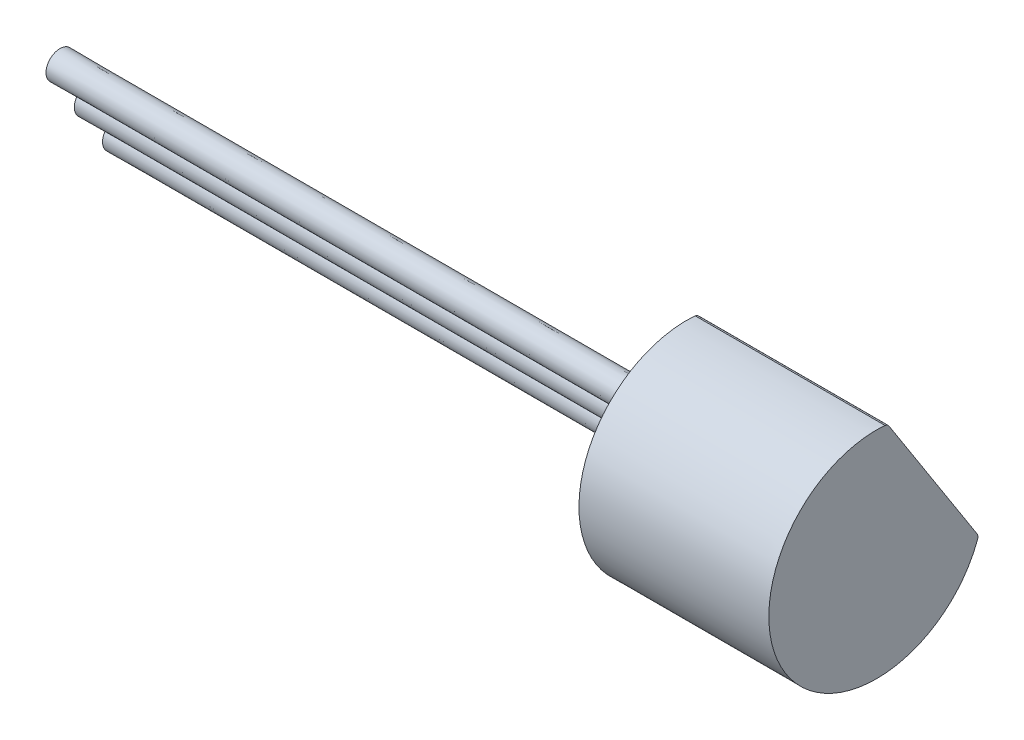
ISO-10303-21;
HEADER;
FILE_DESCRIPTION(('STEP AP214'),'2;1');
FILE_NAME('part.step','',(''),(''),'','','');
FILE_SCHEMA(('AUTOMOTIVE_DESIGN { 1 0 10303 214 1 1 1 1 }'));
ENDSEC;
DATA;
#1=APPLICATION_CONTEXT('core data for automotive mechanical design processes');
#2=APPLICATION_PROTOCOL_DEFINITION('international standard','automotive_design',2000,#1);
#3=PRODUCT_CONTEXT('',#1,'mechanical');
#4=PRODUCT('Part','Part','',(#3));
#5=PRODUCT_RELATED_PRODUCT_CATEGORY('part','',(#4));
#6=PRODUCT_DEFINITION_FORMATION('','',#4);
#7=PRODUCT_DEFINITION_CONTEXT('part definition',#1,'design');
#8=PRODUCT_DEFINITION('design','',#6,#7);
#9=PRODUCT_DEFINITION_SHAPE('','',#8);
#10=(LENGTH_UNIT() NAMED_UNIT(*) SI_UNIT(.MILLI.,.METRE.));
#11=(NAMED_UNIT(*) PLANE_ANGLE_UNIT() SI_UNIT($,.RADIAN.));
#12=(NAMED_UNIT(*) SI_UNIT($,.STERADIAN.) SOLID_ANGLE_UNIT());
#13=UNCERTAINTY_MEASURE_WITH_UNIT(LENGTH_MEASURE(1.E-05),#10,'distance_accuracy_value','');
#14=(GEOMETRIC_REPRESENTATION_CONTEXT(3) GLOBAL_UNCERTAINTY_ASSIGNED_CONTEXT((#13)) GLOBAL_UNIT_ASSIGNED_CONTEXT((#10,
#11,#12)) REPRESENTATION_CONTEXT('',''));
#15=CARTESIAN_POINT('',(0.,0.,0.));
#16=DIRECTION('',(0.,0.,1.));
#17=DIRECTION('',(1.,0.,0.));
#18=AXIS2_PLACEMENT_3D('',#15,#16,#17);
#19=CARTESIAN_POINT('',(0.,225.712503506665,-148.652495898599));
#20=DIRECTION('',(1.,0.,0.));
#21=DIRECTION('',(0.,0.,-1.));
#22=AXIS2_PLACEMENT_3D('',#19,#20,#21);
#23=PLANE('',#22);
#24=DIRECTION('',(0.,0.682534003769191,0.730853838806911));
#25=VECTOR('',#24,1.);
#26=CARTESIAN_POINT('',(0.,229.706686704395,-151.108654203045));
#27=LINE('',#26,#25);
#28=CARTESIAN_POINT('',(0.,229.674293498878,-151.143340677965));
#29=VERTEX_POINT('',#28);
#30=CARTESIAN_POINT('',(0.,229.706686704395,-151.108654203045));
#31=VERTEX_POINT('',#30);
#32=EDGE_CURVE('E135',#29,#31,#27,.T.);
#33=ORIENTED_EDGE('',*,*,#32,.F.);
#34=DIRECTION('',(0.,0.841817923203824,0.539761599386989));
#35=VECTOR('',#34,1.);
#36=CARTESIAN_POINT('',(0.,229.674293498878,-151.143340677965));
#37=LINE('',#36,#35);
#38=CARTESIAN_POINT('',(0.,226.326149061435,-153.290122953228));
#39=VERTEX_POINT('',#38);
#40=EDGE_CURVE('E90',#39,#29,#37,.T.);
#41=ORIENTED_EDGE('',*,*,#40,.F.);
#42=DIRECTION('',(0.,0.949357227616042,0.314198749795701));
#43=VECTOR('',#42,1.);
#44=CARTESIAN_POINT('',(0.,226.326149061435,-153.290122953228));
#45=LINE('',#44,#43);
#46=CARTESIAN_POINT('',(0.,226.272491625306,-153.307881388998));
#47=VERTEX_POINT('',#46);
#48=EDGE_CURVE('E84',#47,#39,#45,.T.);
#49=ORIENTED_EDGE('',*,*,#48,.F.);
#50=DIRECTION('',(0.,0.991665215567442,-0.128841376248387));
#51=VECTOR('',#50,1.);
#52=CARTESIAN_POINT('',(0.,226.272491625306,-153.307881388998));
#53=LINE('',#52,#51);
#54=CARTESIAN_POINT('',(0.,226.216442540559,-153.300599252745));
#55=VERTEX_POINT('',#54);
#56=EDGE_CURVE('E121',#55,#47,#53,.T.);
#57=ORIENTED_EDGE('',*,*,#56,.F.);
#58=CARTESIAN_POINT('',(0.,229.723518521757,-151.054698614687));
#59=CARTESIAN_POINT('',(0.,229.751936455483,-150.691185102579));
#60=CARTESIAN_POINT('',(0.,229.679786830155,-150.334332746994));
#61=CARTESIAN_POINT('',(0.,229.607474815654,-149.976677213865));
#62=CARTESIAN_POINT('',(0.,229.440518215126,-149.653458328288));
#63=CARTESIAN_POINT('',(0.,229.273056787617,-149.329262125171));
#64=CARTESIAN_POINT('',(0.,229.023993777096,-149.064096947885));
#65=CARTESIAN_POINT('',(0.,228.774177674277,-148.798129990149));
#66=CARTESIAN_POINT('',(0.,228.462037686074,-148.611278224828));
#67=CARTESIAN_POINT('',(0.,228.148953879572,-148.423861475455));
#68=CARTESIAN_POINT('',(0.,227.79758568495,-148.32959936089));
#69=CARTESIAN_POINT('',(0.,227.445155057621,-148.235052225782));
#70=CARTESIAN_POINT('',(0.,227.081404623195,-148.240581772909));
#71=CARTESIAN_POINT('',(0.,226.716554315859,-148.246128039738));
#72=CARTESIAN_POINT('',(0.,226.368213662004,-148.351026768551));
#73=CARTESIAN_POINT('',(0.,226.018819729829,-148.456242679856));
#74=CARTESIAN_POINT('',(0.,225.712503506665,-148.652495898599));
#75=CARTESIAN_POINT('',(0.,225.40526107454,-148.849342528582));
#76=CARTESIAN_POINT('',(0.,225.16437309389,-149.121955688973));
#77=CARTESIAN_POINT('',(0.,224.922756739783,-149.39539315031));
#78=CARTESIAN_POINT('',(0.,224.765701828225,-149.723537492321));
#79=CARTESIAN_POINT('',(0.,224.608172029423,-150.052674045023));
#80=CARTESIAN_POINT('',(0.,224.546949824317,-150.411277999325));
#81=CARTESIAN_POINT('',(0.,224.485542501504,-150.770966265138));
#82=CARTESIAN_POINT('',(0.,224.524830629625,-151.132631023449));
#83=CARTESIAN_POINT('',(0.,224.564237553339,-151.495389348235));
#84=CARTESIAN_POINT('',(0.,224.701034241056,-151.832482244428));
#85=CARTESIAN_POINT('',(0.,224.838244561185,-152.170594409072));
#86=CARTESIAN_POINT('',(0.,225.062097982294,-152.457360167665));
#87=CARTESIAN_POINT('',(0.,225.286628269435,-152.744993020449));
#88=CARTESIAN_POINT('',(0.,225.580435107316,-152.959521565038));
#89=CARTESIAN_POINT('',(0.,225.874904082926,-153.174533581843));
#90=CARTESIAN_POINT('',(0.,226.216442540569,-153.300599252719));
#91=B_SPLINE_CURVE_WITH_KNOTS('',2,(#58,#59,#60,#61,#62,#63,#64,#65,#66,#67,#68,#69,#70,#71,#72,
#73,#74,#75,#76,#77,#78,#79,#80,#81,#82,#83,#84,#85,#86,#87,#88,#89,#90),.UNSPECIFIED.,.F.,.F.,
(3,2,2,2,2,2,2,2,2,2,2,2,2,2,2,2,3),(0.,0.0625,0.125,0.1875,0.25,0.3125,0.375,0.4375,0.5,0.5625,
0.625,0.6875,0.75,0.8125,0.875,0.9375,1.),.UNSPECIFIED.);
#92=CARTESIAN_POINT('',(0.,229.723518521757,-151.054698614687));
#93=VERTEX_POINT('',#92);
#94=EDGE_CURVE('E391',#93,#55,#91,.T.);
#95=ORIENTED_EDGE('',*,*,#94,.F.);
#96=DIRECTION('',(0.,0.297802613482662,0.954627468389055));
#97=VECTOR('',#96,1.);
#98=CARTESIAN_POINT('',(0.,229.723518521776,-151.054698614724));
#99=LINE('',#98,#97);
#100=EDGE_CURVE('E138',#31,#93,#99,.T.);
#101=ORIENTED_EDGE('',*,*,#100,.F.);
#102=EDGE_LOOP('',(#33,#41,#49,#57,#95,#101));
#103=FACE_BOUND('',#102,.T.);
#104=CARTESIAN_POINT('',(0.,227.904562219864,-150.346159681849));
#105=CARTESIAN_POINT('',(0.,227.880748070612,-150.308972785154));
#106=CARTESIAN_POINT('',(0.,227.847913639422,-150.225125134153));
#107=CARTESIAN_POINT('',(0.,227.850541711337,-150.090079651998));
#108=CARTESIAN_POINT('',(0.,227.904649401825,-149.966319614658));
#109=CARTESIAN_POINT('',(0.,228.001999305497,-149.872686365931));
#110=CARTESIAN_POINT('',(0.,228.127770781998,-149.823434719146));
#111=CARTESIAN_POINT('',(0.,228.262816264153,-149.826062791061));
#112=CARTESIAN_POINT('',(0.,228.386576301493,-149.880170481549));
#113=CARTESIAN_POINT('',(0.,228.48020955022,-149.977520385221));
#114=CARTESIAN_POINT('',(0.,228.529461197005,-150.103291861722));
#115=CARTESIAN_POINT('',(0.,228.52683312509,-150.238337343876));
#116=CARTESIAN_POINT('',(0.,228.472725434602,-150.362097381216));
#117=CARTESIAN_POINT('',(0.,228.37537553093,-150.455730629944));
#118=CARTESIAN_POINT('',(0.,228.249604054429,-150.504982276728));
#119=CARTESIAN_POINT('',(0.,228.114558572275,-150.502354204814));
#120=CARTESIAN_POINT('',(0.,227.990798534935,-150.448246514326));
#121=CARTESIAN_POINT('',(0.,227.928376369116,-150.383346578545));
#122=CARTESIAN_POINT('',(0.,227.904562219864,-150.346159681849));
#123=B_SPLINE_CURVE_WITH_KNOTS('',3,(#104,#105,#106,#107,#108,#109,#110,#111,#112,#113,#114,
#115,#116,#117,#118,#119,#120,#121,#122),.UNSPECIFIED.,.T.,.F.,(4,1,1,1,1,1,1,1,1,1,1,1,1,1,1,1,
4),(0.,0.0625000000000571,0.125000000000012,0.187500000000002,0.250000000000014,
0.312500000000013,0.375000000000003,0.437499999999958,0.500000000000015,0.562499999999975,
0.625000000000012,0.687500000000002,0.750000000000001,0.812500000000013,0.875000000000003,
0.93750000000004,1.),.UNSPECIFIED.);
#124=CARTESIAN_POINT('',(0.,227.904562219864,-150.346159681849));
#125=VERTEX_POINT('',#124);
#126=EDGE_CURVE('E146',#125,#125,#123,.T.);
#127=ORIENTED_EDGE('',*,*,#126,.F.);
#128=EDGE_LOOP('',(#127));
#129=FACE_BOUND('',#128,.T.);
#130=CARTESIAN_POINT('',(0.,226.835067383283,-151.031054414291));
#131=CARTESIAN_POINT('',(0.,226.811253234031,-150.993867517595));
#132=CARTESIAN_POINT('',(0.,226.778418802841,-150.910019866594));
#133=CARTESIAN_POINT('',(0.,226.781046874756,-150.77497438444));
#134=CARTESIAN_POINT('',(0.,226.835154565244,-150.6512143471));
#135=CARTESIAN_POINT('',(0.,226.932504468916,-150.557581098372));
#136=CARTESIAN_POINT('',(0.,227.058275945417,-150.508329451588));
#137=CARTESIAN_POINT('',(0.,227.193321427572,-150.510957523502));
#138=CARTESIAN_POINT('',(0.,227.317081464911,-150.56506521399));
#139=CARTESIAN_POINT('',(0.,227.410714713639,-150.662415117662));
#140=CARTESIAN_POINT('',(0.,227.459966360424,-150.788186594164));
#141=CARTESIAN_POINT('',(0.,227.457338288509,-150.923232076318));
#142=CARTESIAN_POINT('',(0.,227.403230598021,-151.046992113658));
#143=CARTESIAN_POINT('',(0.,227.305880694349,-151.140625362386));
#144=CARTESIAN_POINT('',(0.,227.180109217848,-151.18987700917));
#145=CARTESIAN_POINT('',(0.,227.045063735693,-151.187248937255));
#146=CARTESIAN_POINT('',(0.,226.921303698354,-151.133141246767));
#147=CARTESIAN_POINT('',(0.,226.858881532535,-151.068241310986));
#148=CARTESIAN_POINT('',(0.,226.835067383283,-151.031054414291));
#149=B_SPLINE_CURVE_WITH_KNOTS('',3,(#130,#131,#132,#133,#134,#135,#136,#137,#138,#139,#140,
#141,#142,#143,#144,#145,#146,#147,#148),.UNSPECIFIED.,.T.,.F.,(4,1,1,1,1,1,1,1,1,1,1,1,1,1,1,1,
4),(0.,0.0625000000000566,0.125000000000004,0.187500000000004,0.250000000000003,
0.312500000000014,0.375000000000003,0.437499999999958,0.500000000000015,0.562499999999974,
0.625000000000011,0.687500000000001,0.750000000000012,0.812500000000011,0.875000000000011,
0.93750000000004,1.),.UNSPECIFIED.);
#150=CARTESIAN_POINT('',(0.,226.835067383283,-151.031054414291));
#151=VERTEX_POINT('',#150);
#152=EDGE_CURVE('E53',#151,#151,#149,.T.);
#153=ORIENTED_EDGE('',*,*,#152,.F.);
#154=EDGE_LOOP('',(#153));
#155=FACE_BOUND('',#154,.T.);
#156=CARTESIAN_POINT('',(0.,225.765572546702,-151.715949146732));
#157=CARTESIAN_POINT('',(0.,225.74175839745,-151.678762250036));
#158=CARTESIAN_POINT('',(0.,225.70892396626,-151.594914599036));
#159=CARTESIAN_POINT('',(0.,225.711552038175,-151.459869116881));
#160=CARTESIAN_POINT('',(0.,225.765659728663,-151.336109079542));
#161=CARTESIAN_POINT('',(0.,225.863009632335,-151.242475830814));
#162=CARTESIAN_POINT('',(0.,225.988781108836,-151.193224184029));
#163=CARTESIAN_POINT('',(0.,226.12382659099,-151.195852255944));
#164=CARTESIAN_POINT('',(0.,226.24758662833,-151.249959946432));
#165=CARTESIAN_POINT('',(0.,226.341219877058,-151.347309850104));
#166=CARTESIAN_POINT('',(0.,226.390471523842,-151.473081326605));
#167=CARTESIAN_POINT('',(0.,226.387843451928,-151.608126808759));
#168=CARTESIAN_POINT('',(0.,226.33373576144,-151.731886846099));
#169=CARTESIAN_POINT('',(0.,226.236385857768,-151.825520094827));
#170=CARTESIAN_POINT('',(0.,226.110614381267,-151.874771741611));
#171=CARTESIAN_POINT('',(0.,225.975568899112,-151.872143669697));
#172=CARTESIAN_POINT('',(0.,225.851808861772,-151.818035979209));
#173=CARTESIAN_POINT('',(0.,225.789386695954,-151.753136043428));
#174=CARTESIAN_POINT('',(0.,225.765572546702,-151.715949146732));
#175=B_SPLINE_CURVE_WITH_KNOTS('',3,(#156,#157,#158,#159,#160,#161,#162,#163,#164,#165,#166,
#167,#168,#169,#170,#171,#172,#173,#174),.UNSPECIFIED.,.T.,.F.,(4,1,1,1,1,1,1,1,1,1,1,1,1,1,1,1,
4),(0.,0.0625000000000538,0.125000000000008,0.187499999999997,0.250000000000008,
0.312500000000007,0.375000000000007,0.437499999999961,0.500000000000015,0.562499999999972,
0.625000000000008,0.687500000000008,0.750000000000006,0.812500000000018,0.875000000000007,
0.937500000000043,1.),.UNSPECIFIED.);
#176=CARTESIAN_POINT('',(0.,225.765572546702,-151.715949146732));
#177=VERTEX_POINT('',#176);
#178=EDGE_CURVE('E11',#177,#177,#175,.T.);
#179=ORIENTED_EDGE('',*,*,#178,.F.);
#180=EDGE_LOOP('',(#179));
#181=FACE_BOUND('',#180,.T.);
#182=ADVANCED_FACE('F41',(#103,#129,#155,#181),#23,.F.);
#183=CARTESIAN_POINT('',(4.6,229.706686704395,-151.108654203045));
#184=DIRECTION('',(0.,-0.730853838806911,0.682534003769191));
#185=DIRECTION('',(0.,-0.682534003769191,-0.730853838806911));
#186=AXIS2_PLACEMENT_3D('',#183,#184,#185);
#187=PLANE('',#186);
#188=ORIENTED_EDGE('',*,*,#32,.T.);
#189=DIRECTION('',(-1.,0.,0.));
#190=VECTOR('',#189,1.);
#191=CARTESIAN_POINT('',(4.6,229.706686704395,-151.108654203045));
#192=LINE('',#191,#190);
#193=CARTESIAN_POINT('',(4.6,229.706686704395,-151.108654203045));
#194=VERTEX_POINT('',#193);
#195=EDGE_CURVE('E145',#194,#31,#192,.T.);
#196=ORIENTED_EDGE('',*,*,#195,.F.);
#197=DIRECTION('',(0.,0.682534003769191,0.730853838806911));
#198=VECTOR('',#197,1.);
#199=CARTESIAN_POINT('',(4.6,229.706686704395,-151.108654203045));
#200=LINE('',#199,#198);
#201=CARTESIAN_POINT('',(4.6,229.674293498878,-151.143340677965));
#202=VERTEX_POINT('',#201);
#203=EDGE_CURVE('E142',#202,#194,#200,.T.);
#204=ORIENTED_EDGE('',*,*,#203,.F.);
#205=DIRECTION('',(-1.,0.,0.));
#206=VECTOR('',#205,1.);
#207=CARTESIAN_POINT('',(4.6,229.674293498878,-151.143340677965));
#208=LINE('',#207,#206);
#209=EDGE_CURVE('E127',#202,#29,#208,.T.);
#210=ORIENTED_EDGE('',*,*,#209,.T.);
#211=EDGE_LOOP('',(#188,#196,#204,#210));
#212=FACE_BOUND('',#211,.T.);
#213=ADVANCED_FACE('F43',(#212),#187,.F.);
#214=CARTESIAN_POINT('',(4.6,229.723518521776,-151.054698614724));
#215=DIRECTION('',(0.,-0.954627468389055,0.297802613482662));
#216=DIRECTION('',(0.,-0.297802613482662,-0.954627468389055));
#217=AXIS2_PLACEMENT_3D('',#214,#215,#216);
#218=PLANE('',#217);
#219=ORIENTED_EDGE('',*,*,#100,.T.);
#220=DIRECTION('',(-1.,0.,0.));
#221=VECTOR('',#220,1.);
#222=CARTESIAN_POINT('',(4.6,229.723518521757,-151.054698614687));
#223=LINE('',#222,#221);
#224=CARTESIAN_POINT('',(4.6,229.723518521757,-151.054698614687));
#225=VERTEX_POINT('',#224);
#226=EDGE_CURVE('E147',#225,#93,#223,.T.);
#227=ORIENTED_EDGE('',*,*,#226,.F.);
#228=DIRECTION('',(0.,0.297802613482662,0.954627468389055));
#229=VECTOR('',#228,1.);
#230=CARTESIAN_POINT('',(4.6,229.723518521776,-151.054698614724));
#231=LINE('',#230,#229);
#232=EDGE_CURVE('E99',#194,#225,#231,.T.);
#233=ORIENTED_EDGE('',*,*,#232,.F.);
#234=ORIENTED_EDGE('',*,*,#195,.T.);
#235=EDGE_LOOP('',(#219,#227,#233,#234));
#236=FACE_BOUND('',#235,.T.);
#237=ADVANCED_FACE('F362',(#236),#218,.F.);
#238=CARTESIAN_POINT('',(4.6,229.723518521757,-151.054698614687));
#239=CARTESIAN_POINT('',(4.6,229.751936455483,-150.691185102579));
#240=CARTESIAN_POINT('',(4.6,229.679786830155,-150.334332746994));
#241=CARTESIAN_POINT('',(4.6,229.607474815654,-149.976677213865));
#242=CARTESIAN_POINT('',(4.6,229.440518215126,-149.653458328288));
#243=CARTESIAN_POINT('',(4.6,229.273056787617,-149.329262125171));
#244=CARTESIAN_POINT('',(4.6,229.023993777096,-149.064096947885));
#245=CARTESIAN_POINT('',(4.6,228.774177674277,-148.798129990149));
#246=CARTESIAN_POINT('',(4.6,228.462037686074,-148.611278224828));
#247=CARTESIAN_POINT('',(4.6,228.148953879572,-148.423861475455));
#248=CARTESIAN_POINT('',(4.6,227.79758568495,-148.32959936089));
#249=CARTESIAN_POINT('',(4.6,227.445155057621,-148.235052225782));
#250=CARTESIAN_POINT('',(4.6,227.081404623195,-148.240581772909));
#251=CARTESIAN_POINT('',(4.6,226.716554315859,-148.246128039738));
#252=CARTESIAN_POINT('',(4.6,226.368213662004,-148.351026768551));
#253=CARTESIAN_POINT('',(4.6,226.018819729829,-148.456242679856));
#254=CARTESIAN_POINT('',(4.6,225.712503506665,-148.652495898599));
#255=CARTESIAN_POINT('',(4.6,225.40526107454,-148.849342528582));
#256=CARTESIAN_POINT('',(4.6,225.16437309389,-149.121955688973));
#257=CARTESIAN_POINT('',(4.6,224.922756739783,-149.39539315031));
#258=CARTESIAN_POINT('',(4.6,224.765701828225,-149.723537492321));
#259=CARTESIAN_POINT('',(4.6,224.608172029423,-150.052674045023));
#260=CARTESIAN_POINT('',(4.6,224.546949824317,-150.411277999325));
#261=CARTESIAN_POINT('',(4.6,224.485542501504,-150.770966265138));
#262=CARTESIAN_POINT('',(4.6,224.524830629625,-151.132631023449));
#263=CARTESIAN_POINT('',(4.6,224.564237553339,-151.495389348235));
#264=CARTESIAN_POINT('',(4.6,224.701034241056,-151.832482244428));
#265=CARTESIAN_POINT('',(4.6,224.838244561185,-152.170594409072));
#266=CARTESIAN_POINT('',(4.6,225.062097982294,-152.457360167665));
#267=CARTESIAN_POINT('',(4.6,225.286628269435,-152.744993020449));
#268=CARTESIAN_POINT('',(4.6,225.580435107316,-152.959521565038));
#269=CARTESIAN_POINT('',(4.6,225.874904082926,-153.174533581843));
#270=CARTESIAN_POINT('',(4.6,226.216442540569,-153.300599252719));
#271=B_SPLINE_CURVE_WITH_KNOTS('',2,(#238,#239,#240,#241,#242,#243,#244,#245,#246,#247,#248,
#249,#250,#251,#252,#253,#254,#255,#256,#257,#258,#259,#260,#261,#262,#263,#264,#265,#266,#267,
#268,#269,#270),.UNSPECIFIED.,.F.,.F.,(3,2,2,2,2,2,2,2,2,2,2,2,2,2,2,2,3),(0.,0.0625,0.125,
0.1875,0.25,0.3125,0.375,0.4375,0.5,0.5625,0.625,0.6875,0.75,0.8125,0.875,0.9375,1.),.UNSPECIFIED.);
#272=DIRECTION('',(-1.,0.,0.));
#273=VECTOR('',#272,1.);
#274=SURFACE_OF_LINEAR_EXTRUSION('',#271,#273);
#275=ORIENTED_EDGE('',*,*,#94,.T.);
#276=DIRECTION('',(-1.,0.,0.));
#277=VECTOR('',#276,1.);
#278=CARTESIAN_POINT('',(4.6,226.216442540559,-153.300599252745));
#279=LINE('',#278,#277);
#280=CARTESIAN_POINT('',(4.6,226.216442540559,-153.300599252745));
#281=VERTEX_POINT('',#280);
#282=EDGE_CURVE('E122',#281,#55,#279,.T.);
#283=ORIENTED_EDGE('',*,*,#282,.F.);
#284=CARTESIAN_POINT('',(4.6,226.216442540569,-153.300599252719));
#285=CARTESIAN_POINT('',(4.6,225.874904082926,-153.174533581843));
#286=CARTESIAN_POINT('',(4.6,225.580435107316,-152.959521565038));
#287=CARTESIAN_POINT('',(4.6,225.286628269435,-152.744993020449));
#288=CARTESIAN_POINT('',(4.6,225.062097982294,-152.457360167665));
#289=CARTESIAN_POINT('',(4.6,224.838244561185,-152.170594409072));
#290=CARTESIAN_POINT('',(4.6,224.701034241056,-151.832482244428));
#291=CARTESIAN_POINT('',(4.6,224.564237553339,-151.495389348235));
#292=CARTESIAN_POINT('',(4.6,224.524830629625,-151.132631023449));
#293=CARTESIAN_POINT('',(4.6,224.485542501504,-150.770966265138));
#294=CARTESIAN_POINT('',(4.6,224.546949824317,-150.411277999325));
#295=CARTESIAN_POINT('',(4.6,224.608172029423,-150.052674045023));
#296=CARTESIAN_POINT('',(4.6,224.765701828225,-149.723537492321));
#297=CARTESIAN_POINT('',(4.6,224.922756739783,-149.39539315031));
#298=CARTESIAN_POINT('',(4.6,225.16437309389,-149.121955688973));
#299=CARTESIAN_POINT('',(4.6,225.40526107454,-148.849342528582));
#300=CARTESIAN_POINT('',(4.6,225.712503506665,-148.652495898599));
#301=CARTESIAN_POINT('',(4.6,226.018819729829,-148.456242679856));
#302=CARTESIAN_POINT('',(4.6,226.368213662004,-148.351026768551));
#303=CARTESIAN_POINT('',(4.6,226.716554315859,-148.246128039738));
#304=CARTESIAN_POINT('',(4.6,227.081404623195,-148.240581772909));
#305=CARTESIAN_POINT('',(4.6,227.445155057621,-148.235052225782));
#306=CARTESIAN_POINT('',(4.6,227.79758568495,-148.32959936089));
#307=CARTESIAN_POINT('',(4.6,228.148953879572,-148.423861475455));
#308=CARTESIAN_POINT('',(4.6,228.462037686074,-148.611278224828));
#309=CARTESIAN_POINT('',(4.6,228.774177674277,-148.798129990149));
#310=CARTESIAN_POINT('',(4.6,229.023993777096,-149.064096947885));
#311=CARTESIAN_POINT('',(4.6,229.273056787617,-149.329262125171));
#312=CARTESIAN_POINT('',(4.6,229.440518215126,-149.653458328288));
#313=CARTESIAN_POINT('',(4.6,229.607474815654,-149.976677213865));
#314=CARTESIAN_POINT('',(4.6,229.679786830155,-150.334332746994));
#315=CARTESIAN_POINT('',(4.6,229.751936455483,-150.691185102579));
#316=CARTESIAN_POINT('',(4.6,229.723518521757,-151.054698614687));
#317=B_SPLINE_CURVE_WITH_KNOTS('',2,(#284,#285,#286,#287,#288,#289,#290,#291,#292,#293,#294,
#295,#296,#297,#298,#299,#300,#301,#302,#303,#304,#305,#306,#307,#308,#309,#310,#311,#312,#313,
#314,#315,#316),.UNSPECIFIED.,.F.,.F.,(3,2,2,2,2,2,2,2,2,2,2,2,2,2,2,2,3),(0.,0.0625,0.125,
0.1875,0.25,0.3125,0.375,0.4375,0.5,0.5625,0.625,0.6875,0.75,0.8125,0.875,0.9375,1.),.UNSPECIFIED.);
#318=EDGE_CURVE('E112',#225,#281,#317,.F.);
#319=ORIENTED_EDGE('',*,*,#318,.F.);
#320=ORIENTED_EDGE('',*,*,#226,.T.);
#321=EDGE_LOOP('',(#275,#283,#319,#320));
#322=FACE_BOUND('',#321,.T.);
#323=ADVANCED_FACE('F354',(#322),#274,.F.);
#324=CARTESIAN_POINT('',(4.6,226.272491625306,-153.307881388998));
#325=DIRECTION('',(0.,0.128841376248387,0.991665215567442));
#326=DIRECTION('',(0.,-0.991665215567442,0.128841376248387));
#327=AXIS2_PLACEMENT_3D('',#324,#325,#326);
#328=PLANE('',#327);
#329=ORIENTED_EDGE('',*,*,#56,.T.);
#330=DIRECTION('',(-1.,0.,0.));
#331=VECTOR('',#330,1.);
#332=CARTESIAN_POINT('',(4.6,226.272491625306,-153.307881388998));
#333=LINE('',#332,#331);
#334=CARTESIAN_POINT('',(4.6,226.272491625306,-153.307881388998));
#335=VERTEX_POINT('',#334);
#336=EDGE_CURVE('E118',#335,#47,#333,.T.);
#337=ORIENTED_EDGE('',*,*,#336,.F.);
#338=DIRECTION('',(0.,0.991665215567442,-0.128841376248387));
#339=VECTOR('',#338,1.);
#340=CARTESIAN_POINT('',(4.6,226.272491625306,-153.307881388998));
#341=LINE('',#340,#339);
#342=EDGE_CURVE('E106',#281,#335,#341,.T.);
#343=ORIENTED_EDGE('',*,*,#342,.F.);
#344=ORIENTED_EDGE('',*,*,#282,.T.);
#345=EDGE_LOOP('',(#329,#337,#343,#344));
#346=FACE_BOUND('',#345,.T.);
#347=ADVANCED_FACE('F119',(#346),#328,.F.);
#348=CARTESIAN_POINT('',(4.6,226.326149061435,-153.290122953228));
#349=DIRECTION('',(0.,-0.314198749795701,0.949357227616042));
#350=DIRECTION('',(0.,-0.949357227616043,-0.314198749795701));
#351=AXIS2_PLACEMENT_3D('',#348,#349,#350);
#352=PLANE('',#351);
#353=ORIENTED_EDGE('',*,*,#48,.T.);
#354=DIRECTION('',(-1.,0.,0.));
#355=VECTOR('',#354,1.);
#356=CARTESIAN_POINT('',(4.6,226.326149061435,-153.290122953228));
#357=LINE('',#356,#355);
#358=CARTESIAN_POINT('',(4.6,226.326149061435,-153.290122953228));
#359=VERTEX_POINT('',#358);
#360=EDGE_CURVE('E123',#359,#39,#357,.T.);
#361=ORIENTED_EDGE('',*,*,#360,.F.);
#362=DIRECTION('',(0.,0.949357227616042,0.314198749795701));
#363=VECTOR('',#362,1.);
#364=CARTESIAN_POINT('',(4.6,226.326149061435,-153.290122953228));
#365=LINE('',#364,#363);
#366=EDGE_CURVE('E110',#335,#359,#365,.T.);
#367=ORIENTED_EDGE('',*,*,#366,.F.);
#368=ORIENTED_EDGE('',*,*,#336,.T.);
#369=EDGE_LOOP('',(#353,#361,#367,#368));
#370=FACE_BOUND('',#369,.T.);
#371=ADVANCED_FACE('F125',(#370),#352,.F.);
#372=CARTESIAN_POINT('',(4.6,229.674293498878,-151.143340677965));
#373=DIRECTION('',(0.,-0.539761599386989,0.841817923203824));
#374=DIRECTION('',(0.,-0.841817923203824,-0.539761599386989));
#375=AXIS2_PLACEMENT_3D('',#372,#373,#374);
#376=PLANE('',#375);
#377=ORIENTED_EDGE('',*,*,#40,.T.);
#378=ORIENTED_EDGE('',*,*,#209,.F.);
#379=DIRECTION('',(0.,0.841817923203824,0.539761599386989));
#380=VECTOR('',#379,1.);
#381=CARTESIAN_POINT('',(4.6,229.674293498878,-151.143340677965));
#382=LINE('',#381,#380);
#383=EDGE_CURVE('E61',#359,#202,#382,.T.);
#384=ORIENTED_EDGE('',*,*,#383,.F.);
#385=ORIENTED_EDGE('',*,*,#360,.T.);
#386=EDGE_LOOP('',(#377,#378,#384,#385));
#387=FACE_BOUND('',#386,.T.);
#388=ADVANCED_FACE('F163',(#387),#376,.F.);
#389=CARTESIAN_POINT('',(4.6,225.712503506665,-148.652495898599));
#390=DIRECTION('',(1.,0.,0.));
#391=DIRECTION('',(0.,0.,-1.));
#392=AXIS2_PLACEMENT_3D('',#389,#390,#391);
#393=PLANE('',#392);
#394=ORIENTED_EDGE('',*,*,#203,.T.);
#395=ORIENTED_EDGE('',*,*,#232,.T.);
#396=ORIENTED_EDGE('',*,*,#318,.T.);
#397=ORIENTED_EDGE('',*,*,#342,.T.);
#398=ORIENTED_EDGE('',*,*,#366,.T.);
#399=ORIENTED_EDGE('',*,*,#383,.T.);
#400=EDGE_LOOP('',(#394,#395,#396,#397,#398,#399));
#401=FACE_BOUND('',#400,.T.);
#402=ADVANCED_FACE('F108',(#401),#393,.T.);
#403=CARTESIAN_POINT('',(-14.5,227.904562219864,-150.346159681849));
#404=CARTESIAN_POINT('',(-14.5,227.880748070612,-150.308972785154));
#405=CARTESIAN_POINT('',(-14.5,227.847913639422,-150.225125134153));
#406=CARTESIAN_POINT('',(-14.5,227.850541711337,-150.090079651998));
#407=CARTESIAN_POINT('',(-14.5,227.904649401825,-149.966319614658));
#408=CARTESIAN_POINT('',(-14.5,228.001999305497,-149.872686365931));
#409=CARTESIAN_POINT('',(-14.5,228.127770781998,-149.823434719146));
#410=CARTESIAN_POINT('',(-14.5,228.262816264153,-149.826062791061));
#411=CARTESIAN_POINT('',(-14.5,228.386576301493,-149.880170481549));
#412=CARTESIAN_POINT('',(-14.5,228.48020955022,-149.977520385221));
#413=CARTESIAN_POINT('',(-14.5,228.529461197005,-150.103291861722));
#414=CARTESIAN_POINT('',(-14.5,228.52683312509,-150.238337343876));
#415=CARTESIAN_POINT('',(-14.5,228.472725434602,-150.362097381216));
#416=CARTESIAN_POINT('',(-14.5,228.37537553093,-150.455730629944));
#417=CARTESIAN_POINT('',(-14.5,228.249604054429,-150.504982276728));
#418=CARTESIAN_POINT('',(-14.5,228.114558572275,-150.502354204814));
#419=CARTESIAN_POINT('',(-14.5,227.990798534935,-150.448246514326));
#420=CARTESIAN_POINT('',(-14.5,227.928376369116,-150.383346578545));
#421=CARTESIAN_POINT('',(-14.5,227.904562219864,-150.346159681849));
#422=B_SPLINE_CURVE_WITH_KNOTS('',3,(#403,#404,#405,#406,#407,#408,#409,#410,#411,#412,#413,
#414,#415,#416,#417,#418,#419,#420,#421),.UNSPECIFIED.,.T.,.F.,(4,1,1,1,1,1,1,1,1,1,1,1,1,1,1,1,
4),(0.,0.0625000000000571,0.125000000000012,0.187500000000002,0.250000000000014,
0.312500000000013,0.375000000000003,0.437499999999958,0.500000000000015,0.562499999999975,
0.625000000000012,0.687500000000002,0.750000000000001,0.812500000000013,0.875000000000003,
0.93750000000004,1.),.UNSPECIFIED.);
#423=DIRECTION('',(1.,0.,0.));
#424=VECTOR('',#423,1.);
#425=SURFACE_OF_LINEAR_EXTRUSION('',#422,#424);
#426=CARTESIAN_POINT('',(-14.5,227.904562219864,-150.346159681849));
#427=CARTESIAN_POINT('',(-14.5,227.928376369116,-150.383346578545));
#428=CARTESIAN_POINT('',(-14.5,227.990798534935,-150.448246514326));
#429=CARTESIAN_POINT('',(-14.5,228.114558572275,-150.502354204814));
#430=CARTESIAN_POINT('',(-14.5,228.249604054429,-150.504982276728));
#431=CARTESIAN_POINT('',(-14.5,228.37537553093,-150.455730629944));
#432=CARTESIAN_POINT('',(-14.5,228.472725434602,-150.362097381216));
#433=CARTESIAN_POINT('',(-14.5,228.52683312509,-150.238337343876));
#434=CARTESIAN_POINT('',(-14.5,228.529461197005,-150.103291861722));
#435=CARTESIAN_POINT('',(-14.5,228.48020955022,-149.977520385221));
#436=CARTESIAN_POINT('',(-14.5,228.386576301493,-149.880170481549));
#437=CARTESIAN_POINT('',(-14.5,228.262816264153,-149.826062791061));
#438=CARTESIAN_POINT('',(-14.5,228.127770781998,-149.823434719146));
#439=CARTESIAN_POINT('',(-14.5,228.001999305497,-149.872686365931));
#440=CARTESIAN_POINT('',(-14.5,227.904649401825,-149.966319614658));
#441=CARTESIAN_POINT('',(-14.5,227.850541711337,-150.090079651998));
#442=CARTESIAN_POINT('',(-14.5,227.847913639422,-150.225125134153));
#443=CARTESIAN_POINT('',(-14.5,227.880748070612,-150.308972785154));
#444=CARTESIAN_POINT('',(-14.5,227.904562219864,-150.346159681849));
#445=B_SPLINE_CURVE_WITH_KNOTS('',3,(#426,#427,#428,#429,#430,#431,#432,#433,#434,#435,#436,
#437,#438,#439,#440,#441,#442,#443,#444),.UNSPECIFIED.,.T.,.F.,(4,1,1,1,1,1,1,1,1,1,1,1,1,1,1,1,
4),(0.,0.0624999999999601,0.124999999999997,0.187499999999987,0.249999999999999,
0.312499999999998,0.374999999999988,0.437500000000025,0.499999999999985,0.562500000000042,
0.624999999999997,0.687499999999987,0.749999999999986,0.812499999999998,0.874999999999988,
0.937499999999943,1.),.UNSPECIFIED.);
#446=CARTESIAN_POINT('',(-14.5,227.904562219864,-150.346159681849));
#447=VERTEX_POINT('',#446);
#448=EDGE_CURVE('E250',#447,#447,#445,.F.);
#449=ORIENTED_EDGE('',*,*,#448,.F.);
#450=EDGE_LOOP('',(#449));
#451=FACE_BOUND('',#450,.T.);
#452=ORIENTED_EDGE('',*,*,#126,.T.);
#453=EDGE_LOOP('',(#452));
#454=FACE_BOUND('',#453,.T.);
#455=ADVANCED_FACE('F162',(#451,#454),#425,.F.);
#456=CARTESIAN_POINT('',(-14.5,228.472812616563,-149.982257314026));
#457=DIRECTION('',(1.,0.,0.));
#458=DIRECTION('',(0.,0.,-1.));
#459=AXIS2_PLACEMENT_3D('',#456,#457,#458);
#460=PLANE('',#459);
#461=ORIENTED_EDGE('',*,*,#448,.T.);
#462=EDGE_LOOP('',(#461));
#463=FACE_BOUND('',#462,.T.);
#464=ADVANCED_FACE('F164',(#463),#460,.F.);
#465=CARTESIAN_POINT('',(-14.5,226.835067383283,-151.031054414291));
#466=CARTESIAN_POINT('',(-14.5,226.811253234031,-150.993867517595));
#467=CARTESIAN_POINT('',(-14.5,226.778418802841,-150.910019866594));
#468=CARTESIAN_POINT('',(-14.5,226.781046874756,-150.77497438444));
#469=CARTESIAN_POINT('',(-14.5,226.835154565244,-150.6512143471));
#470=CARTESIAN_POINT('',(-14.5,226.932504468916,-150.557581098372));
#471=CARTESIAN_POINT('',(-14.5,227.058275945417,-150.508329451588));
#472=CARTESIAN_POINT('',(-14.5,227.193321427572,-150.510957523502));
#473=CARTESIAN_POINT('',(-14.5,227.317081464911,-150.56506521399));
#474=CARTESIAN_POINT('',(-14.5,227.410714713639,-150.662415117662));
#475=CARTESIAN_POINT('',(-14.5,227.459966360424,-150.788186594164));
#476=CARTESIAN_POINT('',(-14.5,227.457338288509,-150.923232076318));
#477=CARTESIAN_POINT('',(-14.5,227.403230598021,-151.046992113658));
#478=CARTESIAN_POINT('',(-14.5,227.305880694349,-151.140625362386));
#479=CARTESIAN_POINT('',(-14.5,227.180109217848,-151.18987700917));
#480=CARTESIAN_POINT('',(-14.5,227.045063735693,-151.187248937255));
#481=CARTESIAN_POINT('',(-14.5,226.921303698354,-151.133141246767));
#482=CARTESIAN_POINT('',(-14.5,226.858881532535,-151.068241310986));
#483=CARTESIAN_POINT('',(-14.5,226.835067383283,-151.031054414291));
#484=B_SPLINE_CURVE_WITH_KNOTS('',3,(#465,#466,#467,#468,#469,#470,#471,#472,#473,#474,#475,
#476,#477,#478,#479,#480,#481,#482,#483),.UNSPECIFIED.,.T.,.F.,(4,1,1,1,1,1,1,1,1,1,1,1,1,1,1,1,
4),(0.,0.0625000000000566,0.125000000000004,0.187500000000004,0.250000000000003,
0.312500000000014,0.375000000000003,0.437499999999958,0.500000000000015,0.562499999999974,
0.625000000000011,0.687500000000001,0.750000000000012,0.812500000000011,0.875000000000011,
0.93750000000004,1.),.UNSPECIFIED.);
#485=DIRECTION('',(1.,0.,0.));
#486=VECTOR('',#485,1.);
#487=SURFACE_OF_LINEAR_EXTRUSION('',#484,#486);
#488=CARTESIAN_POINT('',(-14.5,226.835067383283,-151.031054414291));
#489=CARTESIAN_POINT('',(-14.5,226.858881532535,-151.068241310986));
#490=CARTESIAN_POINT('',(-14.5,226.921303698354,-151.133141246767));
#491=CARTESIAN_POINT('',(-14.5,227.045063735693,-151.187248937255));
#492=CARTESIAN_POINT('',(-14.5,227.180109217848,-151.18987700917));
#493=CARTESIAN_POINT('',(-14.5,227.305880694349,-151.140625362386));
#494=CARTESIAN_POINT('',(-14.5,227.403230598021,-151.046992113658));
#495=CARTESIAN_POINT('',(-14.5,227.457338288509,-150.923232076318));
#496=CARTESIAN_POINT('',(-14.5,227.459966360424,-150.788186594164));
#497=CARTESIAN_POINT('',(-14.5,227.410714713639,-150.662415117662));
#498=CARTESIAN_POINT('',(-14.5,227.317081464911,-150.56506521399));
#499=CARTESIAN_POINT('',(-14.5,227.193321427572,-150.510957523502));
#500=CARTESIAN_POINT('',(-14.5,227.058275945417,-150.508329451588));
#501=CARTESIAN_POINT('',(-14.5,226.932504468916,-150.557581098372));
#502=CARTESIAN_POINT('',(-14.5,226.835154565244,-150.6512143471));
#503=CARTESIAN_POINT('',(-14.5,226.781046874756,-150.77497438444));
#504=CARTESIAN_POINT('',(-14.5,226.778418802841,-150.910019866594));
#505=CARTESIAN_POINT('',(-14.5,226.811253234031,-150.993867517595));
#506=CARTESIAN_POINT('',(-14.5,226.835067383283,-151.031054414291));
#507=B_SPLINE_CURVE_WITH_KNOTS('',3,(#488,#489,#490,#491,#492,#493,#494,#495,#496,#497,#498,
#499,#500,#501,#502,#503,#504,#505,#506),.UNSPECIFIED.,.T.,.F.,(4,1,1,1,1,1,1,1,1,1,1,1,1,1,1,1,
4),(0.,0.0624999999999597,0.124999999999989,0.187499999999989,0.249999999999988,
0.312499999999999,0.374999999999989,0.437500000000026,0.499999999999985,0.562500000000042,
0.624999999999997,0.687499999999986,0.749999999999997,0.812499999999996,0.874999999999996,
0.937499999999943,1.),.UNSPECIFIED.);
#508=CARTESIAN_POINT('',(-14.5,226.835067383283,-151.031054414291));
#509=VERTEX_POINT('',#508);
#510=EDGE_CURVE('E248',#509,#509,#507,.F.);
#511=ORIENTED_EDGE('',*,*,#510,.F.);
#512=EDGE_LOOP('',(#511));
#513=FACE_BOUND('',#512,.T.);
#514=ORIENTED_EDGE('',*,*,#152,.T.);
#515=EDGE_LOOP('',(#514));
#516=FACE_BOUND('',#515,.T.);
#517=ADVANCED_FACE('F225',(#513,#516),#487,.F.);
#518=CARTESIAN_POINT('',(-14.5,227.403317779982,-150.667152046467));
#519=DIRECTION('',(1.,0.,0.));
#520=DIRECTION('',(0.,0.,-1.));
#521=AXIS2_PLACEMENT_3D('',#518,#519,#520);
#522=PLANE('',#521);
#523=ORIENTED_EDGE('',*,*,#510,.T.);
#524=EDGE_LOOP('',(#523));
#525=FACE_BOUND('',#524,.T.);
#526=ADVANCED_FACE('F222',(#525),#522,.F.);
#527=CARTESIAN_POINT('',(-14.5,225.765572546702,-151.715949146732));
#528=CARTESIAN_POINT('',(-14.5,225.74175839745,-151.678762250036));
#529=CARTESIAN_POINT('',(-14.5,225.70892396626,-151.594914599036));
#530=CARTESIAN_POINT('',(-14.5,225.711552038175,-151.459869116881));
#531=CARTESIAN_POINT('',(-14.5,225.765659728663,-151.336109079542));
#532=CARTESIAN_POINT('',(-14.5,225.863009632335,-151.242475830814));
#533=CARTESIAN_POINT('',(-14.5,225.988781108836,-151.193224184029));
#534=CARTESIAN_POINT('',(-14.5,226.12382659099,-151.195852255944));
#535=CARTESIAN_POINT('',(-14.5,226.24758662833,-151.249959946432));
#536=CARTESIAN_POINT('',(-14.5,226.341219877058,-151.347309850104));
#537=CARTESIAN_POINT('',(-14.5,226.390471523842,-151.473081326605));
#538=CARTESIAN_POINT('',(-14.5,226.387843451928,-151.608126808759));
#539=CARTESIAN_POINT('',(-14.5,226.33373576144,-151.731886846099));
#540=CARTESIAN_POINT('',(-14.5,226.236385857768,-151.825520094827));
#541=CARTESIAN_POINT('',(-14.5,226.110614381267,-151.874771741611));
#542=CARTESIAN_POINT('',(-14.5,225.975568899112,-151.872143669697));
#543=CARTESIAN_POINT('',(-14.5,225.851808861772,-151.818035979209));
#544=CARTESIAN_POINT('',(-14.5,225.789386695954,-151.753136043428));
#545=CARTESIAN_POINT('',(-14.5,225.765572546702,-151.715949146732));
#546=B_SPLINE_CURVE_WITH_KNOTS('',3,(#527,#528,#529,#530,#531,#532,#533,#534,#535,#536,#537,
#538,#539,#540,#541,#542,#543,#544,#545),.UNSPECIFIED.,.T.,.F.,(4,1,1,1,1,1,1,1,1,1,1,1,1,1,1,1,
4),(0.,0.0625000000000538,0.125000000000008,0.187499999999997,0.250000000000008,
0.312500000000007,0.375000000000007,0.437499999999961,0.500000000000015,0.562499999999972,
0.625000000000008,0.687500000000008,0.750000000000006,0.812500000000018,0.875000000000007,
0.937500000000043,1.),.UNSPECIFIED.);
#547=DIRECTION('',(1.,0.,0.));
#548=VECTOR('',#547,1.);
#549=SURFACE_OF_LINEAR_EXTRUSION('',#546,#548);
#550=CARTESIAN_POINT('',(-14.5,225.765572546702,-151.715949146732));
#551=CARTESIAN_POINT('',(-14.5,225.789386695954,-151.753136043428));
#552=CARTESIAN_POINT('',(-14.5,225.851808861772,-151.818035979209));
#553=CARTESIAN_POINT('',(-14.5,225.975568899112,-151.872143669697));
#554=CARTESIAN_POINT('',(-14.5,226.110614381267,-151.874771741611));
#555=CARTESIAN_POINT('',(-14.5,226.236385857768,-151.825520094827));
#556=CARTESIAN_POINT('',(-14.5,226.33373576144,-151.731886846099));
#557=CARTESIAN_POINT('',(-14.5,226.387843451928,-151.608126808759));
#558=CARTESIAN_POINT('',(-14.5,226.390471523842,-151.473081326605));
#559=CARTESIAN_POINT('',(-14.5,226.341219877058,-151.347309850104));
#560=CARTESIAN_POINT('',(-14.5,226.24758662833,-151.249959946432));
#561=CARTESIAN_POINT('',(-14.5,226.12382659099,-151.195852255944));
#562=CARTESIAN_POINT('',(-14.5,225.988781108836,-151.193224184029));
#563=CARTESIAN_POINT('',(-14.5,225.863009632335,-151.242475830814));
#564=CARTESIAN_POINT('',(-14.5,225.765659728663,-151.336109079542));
#565=CARTESIAN_POINT('',(-14.5,225.711552038175,-151.459869116881));
#566=CARTESIAN_POINT('',(-14.5,225.70892396626,-151.594914599036));
#567=CARTESIAN_POINT('',(-14.5,225.74175839745,-151.678762250036));
#568=CARTESIAN_POINT('',(-14.5,225.765572546702,-151.715949146732));
#569=B_SPLINE_CURVE_WITH_KNOTS('',3,(#550,#551,#552,#553,#554,#555,#556,#557,#558,#559,#560,
#561,#562,#563,#564,#565,#566,#567,#568),.UNSPECIFIED.,.T.,.F.,(4,1,1,1,1,1,1,1,1,1,1,1,1,1,1,1,
4),(0.,0.0624999999999569,0.124999999999993,0.187499999999982,0.249999999999994,
0.312499999999992,0.374999999999992,0.437500000000028,0.499999999999985,0.562500000000039,
0.624999999999993,0.687499999999993,0.749999999999992,0.812500000000003,0.874999999999992,
0.937499999999946,1.),.UNSPECIFIED.);
#570=CARTESIAN_POINT('',(-14.5,225.765572546702,-151.715949146732));
#571=VERTEX_POINT('',#570);
#572=EDGE_CURVE('E139',#571,#571,#569,.F.);
#573=ORIENTED_EDGE('',*,*,#572,.F.);
#574=EDGE_LOOP('',(#573));
#575=FACE_BOUND('',#574,.T.);
#576=ORIENTED_EDGE('',*,*,#178,.T.);
#577=EDGE_LOOP('',(#576));
#578=FACE_BOUND('',#577,.T.);
#579=ADVANCED_FACE('F198',(#575,#578),#549,.F.);
#580=CARTESIAN_POINT('',(-14.5,226.333822943401,-151.352046778909));
#581=DIRECTION('',(1.,0.,0.));
#582=DIRECTION('',(0.,0.,-1.));
#583=AXIS2_PLACEMENT_3D('',#580,#581,#582);
#584=PLANE('',#583);
#585=ORIENTED_EDGE('',*,*,#572,.T.);
#586=EDGE_LOOP('',(#585));
#587=FACE_BOUND('',#586,.T.);
#588=ADVANCED_FACE('F221',(#587),#584,.F.);
#589=CLOSED_SHELL('',(#182,#213,#237,#323,#347,#371,#388,#402,#455,#464,#517,#526,#579,#588));
#590=MANIFOLD_SOLID_BREP('B2',#589);
#591=ADVANCED_BREP_SHAPE_REPRESENTATION('',(#18,#590),#14);
#592=SHAPE_DEFINITION_REPRESENTATION(#9,#591);
ENDSEC;
END-ISO-10303-21;
